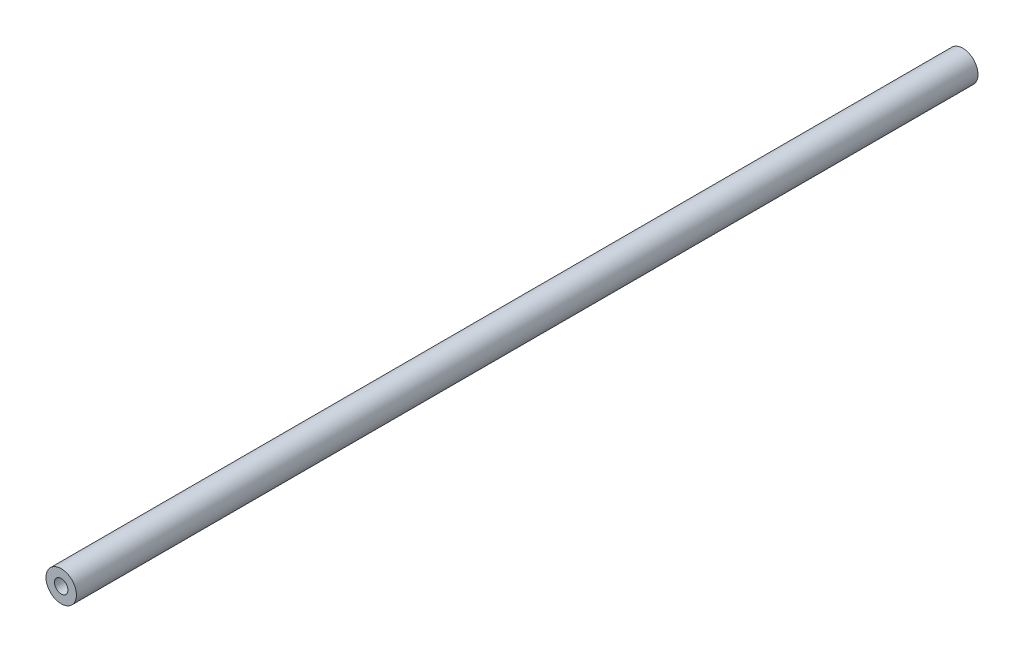
ISO-10303-21;
HEADER;
FILE_DESCRIPTION(('STEP AP214'),'2;1');
FILE_NAME('part.step','',(''),(''),'','','');
FILE_SCHEMA(('AUTOMOTIVE_DESIGN { 1 0 10303 214 1 1 1 1 }'));
ENDSEC;
DATA;
#1=APPLICATION_CONTEXT('core data for automotive mechanical design processes');
#2=APPLICATION_PROTOCOL_DEFINITION('international standard','automotive_design',2000,#1);
#3=PRODUCT_CONTEXT('',#1,'mechanical');
#4=PRODUCT('Part','Part','',(#3));
#5=PRODUCT_RELATED_PRODUCT_CATEGORY('part','',(#4));
#6=PRODUCT_DEFINITION_FORMATION('','',#4);
#7=PRODUCT_DEFINITION_CONTEXT('part definition',#1,'design');
#8=PRODUCT_DEFINITION('design','',#6,#7);
#9=PRODUCT_DEFINITION_SHAPE('','',#8);
#10=(LENGTH_UNIT() NAMED_UNIT(*) SI_UNIT(.MILLI.,.METRE.));
#11=(NAMED_UNIT(*) PLANE_ANGLE_UNIT() SI_UNIT($,.RADIAN.));
#12=(NAMED_UNIT(*) SI_UNIT($,.STERADIAN.) SOLID_ANGLE_UNIT());
#13=UNCERTAINTY_MEASURE_WITH_UNIT(LENGTH_MEASURE(1.E-05),#10,'distance_accuracy_value','');
#14=(GEOMETRIC_REPRESENTATION_CONTEXT(3) GLOBAL_UNCERTAINTY_ASSIGNED_CONTEXT((#13)) GLOBAL_UNIT_ASSIGNED_CONTEXT((#10,
#11,#12)) REPRESENTATION_CONTEXT('',''));
#15=CARTESIAN_POINT('',(0.,0.,0.));
#16=DIRECTION('',(0.,0.,1.));
#17=DIRECTION('',(1.,0.,0.));
#18=AXIS2_PLACEMENT_3D('',#15,#16,#17);
#19=CARTESIAN_POINT('',(0.,0.,117.475));
#20=DIRECTION('',(0.,0.,-1.));
#21=DIRECTION('',(-1.,0.,0.));
#22=AXIS2_PLACEMENT_3D('',#19,#20,#21);
#23=CYLINDRICAL_SURFACE('',#22,3.96875);
#24=CARTESIAN_POINT('',(0.,0.,117.475));
#25=DIRECTION('',(0.,0.,1.));
#26=DIRECTION('',(1.,0.,0.));
#27=AXIS2_PLACEMENT_3D('',#24,#25,#26);
#28=CIRCLE('',#27,3.96875);
#29=CARTESIAN_POINT('',(3.96875,0.,117.475));
#30=VERTEX_POINT('',#29);
#31=EDGE_CURVE('E11',#30,#30,#28,.T.);
#32=ORIENTED_EDGE('',*,*,#31,.F.);
#33=EDGE_LOOP('',(#32));
#34=FACE_BOUND('',#33,.T.);
#35=CARTESIAN_POINT('',(0.,0.,-117.475));
#36=DIRECTION('',(0.,0.,1.));
#37=DIRECTION('',(1.,0.,0.));
#38=AXIS2_PLACEMENT_3D('',#35,#36,#37);
#39=CIRCLE('',#38,3.96875);
#40=CARTESIAN_POINT('',(3.96875,0.,-117.475));
#41=VERTEX_POINT('',#40);
#42=EDGE_CURVE('E37',#41,#41,#39,.T.);
#43=ORIENTED_EDGE('',*,*,#42,.T.);
#44=EDGE_LOOP('',(#43));
#45=FACE_BOUND('',#44,.T.);
#46=ADVANCED_FACE('F34',(#34,#45),#23,.T.);
#47=CARTESIAN_POINT('',(0.,0.,117.475));
#48=DIRECTION('',(0.,0.,1.));
#49=DIRECTION('',(1.,0.,0.));
#50=AXIS2_PLACEMENT_3D('',#47,#48,#49);
#51=PLANE('',#50);
#52=CARTESIAN_POINT('',(0.,0.,117.475));
#53=DIRECTION('',(0.,0.,1.));
#54=DIRECTION('',(1.,0.,0.));
#55=AXIS2_PLACEMENT_3D('',#52,#53,#54);
#56=CIRCLE('',#55,1.7526);
#57=CARTESIAN_POINT('',(1.7526,0.,117.475));
#58=VERTEX_POINT('',#57);
#59=EDGE_CURVE('E191',#58,#58,#56,.T.);
#60=ORIENTED_EDGE('',*,*,#59,.F.);
#61=EDGE_LOOP('',(#60));
#62=FACE_BOUND('',#61,.T.);
#63=ORIENTED_EDGE('',*,*,#31,.T.);
#64=EDGE_LOOP('',(#63));
#65=FACE_BOUND('',#64,.T.);
#66=ADVANCED_FACE('F84',(#62,#65),#51,.T.);
#67=CARTESIAN_POINT('',(0.,0.,-117.475));
#68=DIRECTION('',(0.,0.,1.));
#69=DIRECTION('',(1.,0.,0.));
#70=AXIS2_PLACEMENT_3D('',#67,#68,#69);
#71=PLANE('',#70);
#72=CARTESIAN_POINT('',(0.,0.,-117.475));
#73=DIRECTION('',(0.,0.,-1.));
#74=DIRECTION('',(-1.,0.,0.));
#75=AXIS2_PLACEMENT_3D('',#72,#73,#74);
#76=CIRCLE('',#75,1.7526);
#77=CARTESIAN_POINT('',(-1.7526,0.,-117.475));
#78=VERTEX_POINT('',#77);
#79=EDGE_CURVE('E57',#78,#78,#76,.T.);
#80=ORIENTED_EDGE('',*,*,#79,.F.);
#81=EDGE_LOOP('',(#80));
#82=FACE_BOUND('',#81,.T.);
#83=ORIENTED_EDGE('',*,*,#42,.F.);
#84=EDGE_LOOP('',(#83));
#85=FACE_BOUND('',#84,.T.);
#86=ADVANCED_FACE('F81',(#82,#85),#71,.F.);
#87=CARTESIAN_POINT('',(0.,0.,-108.077));
#88=DIRECTION('',(0.,0.,-1.));
#89=DIRECTION('',(-1.,0.,0.));
#90=AXIS2_PLACEMENT_3D('',#87,#88,#89);
#91=CONICAL_SURFACE('',#90,1.35255,1.02974425867665);
#92=CARTESIAN_POINT('',(0.,0.,-107.264305969734));
#93=VERTEX_POINT('',#92);
#94=VERTEX_LOOP('',#93);
#95=FACE_BOUND('',#94,.T.);
#96=CARTESIAN_POINT('',(0.,0.,-108.077));
#97=DIRECTION('',(0.,0.,-1.));
#98=DIRECTION('',(-1.,0.,0.));
#99=AXIS2_PLACEMENT_3D('',#96,#97,#98);
#100=CIRCLE('',#99,1.35255);
#101=CARTESIAN_POINT('',(-1.35255,0.,-108.077));
#102=VERTEX_POINT('',#101);
#103=EDGE_CURVE('E73',#102,#102,#100,.T.);
#104=ORIENTED_EDGE('',*,*,#103,.T.);
#105=EDGE_LOOP('',(#104));
#106=FACE_BOUND('',#105,.T.);
#107=ADVANCED_FACE('F83',(#95,#106),#91,.F.);
#108=CARTESIAN_POINT('',(0.,0.,-117.475));
#109=DIRECTION('',(0.,0.,-1.));
#110=DIRECTION('',(-1.,0.,0.));
#111=AXIS2_PLACEMENT_3D('',#108,#109,#110);
#112=CYLINDRICAL_SURFACE('',#111,1.35255);
#113=ORIENTED_EDGE('',*,*,#103,.F.);
#114=EDGE_LOOP('',(#113));
#115=FACE_BOUND('',#114,.T.);
#116=CARTESIAN_POINT('',(0.,0.,-110.363));
#117=DIRECTION('',(0.,0.,-1.));
#118=DIRECTION('',(-1.,0.,0.));
#119=AXIS2_PLACEMENT_3D('',#116,#117,#118);
#120=CIRCLE('',#119,1.35255);
#121=CARTESIAN_POINT('',(-1.35255,0.,-110.363));
#122=VERTEX_POINT('',#121);
#123=EDGE_CURVE('E70',#122,#122,#120,.T.);
#124=ORIENTED_EDGE('',*,*,#123,.T.);
#125=EDGE_LOOP('',(#124));
#126=FACE_BOUND('',#125,.T.);
#127=ADVANCED_FACE('F90',(#115,#126),#112,.F.);
#128=CARTESIAN_POINT('',(1.35255,0.,-110.363));
#129=DIRECTION('',(0.,0.,1.));
#130=DIRECTION('',(1.,0.,0.));
#131=AXIS2_PLACEMENT_3D('',#128,#129,#130);
#132=PLANE('',#131);
#133=ORIENTED_EDGE('',*,*,#123,.F.);
#134=EDGE_LOOP('',(#133));
#135=FACE_BOUND('',#134,.T.);
#136=CARTESIAN_POINT('',(0.,0.,-110.363));
#137=DIRECTION('',(0.,0.,-1.));
#138=DIRECTION('',(-1.,0.,0.));
#139=AXIS2_PLACEMENT_3D('',#136,#137,#138);
#140=CIRCLE('',#139,1.7526);
#141=CARTESIAN_POINT('',(-1.7526,0.,-110.363));
#142=VERTEX_POINT('',#141);
#143=EDGE_CURVE('E61',#142,#142,#140,.T.);
#144=ORIENTED_EDGE('',*,*,#143,.T.);
#145=EDGE_LOOP('',(#144));
#146=FACE_BOUND('',#145,.T.);
#147=ADVANCED_FACE('F153',(#135,#146),#132,.F.);
#148=CARTESIAN_POINT('',(0.,0.,-117.475));
#149=DIRECTION('',(0.,0.,-1.));
#150=DIRECTION('',(-1.,0.,0.));
#151=AXIS2_PLACEMENT_3D('',#148,#149,#150);
#152=CYLINDRICAL_SURFACE('',#151,1.7526);
#153=ORIENTED_EDGE('',*,*,#143,.F.);
#154=EDGE_LOOP('',(#153));
#155=FACE_BOUND('',#154,.T.);
#156=ORIENTED_EDGE('',*,*,#79,.T.);
#157=EDGE_LOOP('',(#156));
#158=FACE_BOUND('',#157,.T.);
#159=ADVANCED_FACE('F51',(#155,#158),#152,.F.);
#160=CARTESIAN_POINT('',(0.,0.,108.077));
#161=DIRECTION('',(0.,0.,1.));
#162=DIRECTION('',(1.,0.,0.));
#163=AXIS2_PLACEMENT_3D('',#160,#161,#162);
#164=CONICAL_SURFACE('',#163,1.35255,1.02974425867665);
#165=CARTESIAN_POINT('',(0.,0.,107.264305969734));
#166=VERTEX_POINT('',#165);
#167=VERTEX_LOOP('',#166);
#168=FACE_BOUND('',#167,.T.);
#169=CARTESIAN_POINT('',(0.,0.,108.077));
#170=DIRECTION('',(0.,0.,1.));
#171=DIRECTION('',(1.,0.,0.));
#172=AXIS2_PLACEMENT_3D('',#169,#170,#171);
#173=CIRCLE('',#172,1.35255);
#174=CARTESIAN_POINT('',(1.35255,0.,108.077));
#175=VERTEX_POINT('',#174);
#176=EDGE_CURVE('E55',#175,#175,#173,.T.);
#177=ORIENTED_EDGE('',*,*,#176,.T.);
#178=EDGE_LOOP('',(#177));
#179=FACE_BOUND('',#178,.T.);
#180=ADVANCED_FACE('F47',(#168,#179),#164,.F.);
#181=CARTESIAN_POINT('',(0.,0.,117.475));
#182=DIRECTION('',(0.,0.,1.));
#183=DIRECTION('',(1.,0.,0.));
#184=AXIS2_PLACEMENT_3D('',#181,#182,#183);
#185=CYLINDRICAL_SURFACE('',#184,1.35255);
#186=ORIENTED_EDGE('',*,*,#176,.F.);
#187=EDGE_LOOP('',(#186));
#188=FACE_BOUND('',#187,.T.);
#189=CARTESIAN_POINT('',(0.,0.,110.363));
#190=DIRECTION('',(0.,0.,1.));
#191=DIRECTION('',(1.,0.,0.));
#192=AXIS2_PLACEMENT_3D('',#189,#190,#191);
#193=CIRCLE('',#192,1.35255);
#194=CARTESIAN_POINT('',(1.35255,0.,110.363));
#195=VERTEX_POINT('',#194);
#196=EDGE_CURVE('E58',#195,#195,#193,.T.);
#197=ORIENTED_EDGE('',*,*,#196,.T.);
#198=EDGE_LOOP('',(#197));
#199=FACE_BOUND('',#198,.T.);
#200=ADVANCED_FACE('F50',(#188,#199),#185,.F.);
#201=CARTESIAN_POINT('',(1.35255,0.,110.363));
#202=DIRECTION('',(0.,0.,-1.));
#203=DIRECTION('',(-1.,0.,0.));
#204=AXIS2_PLACEMENT_3D('',#201,#202,#203);
#205=PLANE('',#204);
#206=ORIENTED_EDGE('',*,*,#196,.F.);
#207=EDGE_LOOP('',(#206));
#208=FACE_BOUND('',#207,.T.);
#209=CARTESIAN_POINT('',(0.,0.,110.363));
#210=DIRECTION('',(0.,0.,1.));
#211=DIRECTION('',(1.,0.,0.));
#212=AXIS2_PLACEMENT_3D('',#209,#210,#211);
#213=CIRCLE('',#212,1.7526);
#214=CARTESIAN_POINT('',(1.7526,0.,110.363));
#215=VERTEX_POINT('',#214);
#216=EDGE_CURVE('E64',#215,#215,#213,.T.);
#217=ORIENTED_EDGE('',*,*,#216,.T.);
#218=EDGE_LOOP('',(#217));
#219=FACE_BOUND('',#218,.T.);
#220=ADVANCED_FACE('F126',(#208,#219),#205,.F.);
#221=CARTESIAN_POINT('',(0.,0.,117.475));
#222=DIRECTION('',(0.,0.,1.));
#223=DIRECTION('',(1.,0.,0.));
#224=AXIS2_PLACEMENT_3D('',#221,#222,#223);
#225=CYLINDRICAL_SURFACE('',#224,1.7526);
#226=ORIENTED_EDGE('',*,*,#216,.F.);
#227=EDGE_LOOP('',(#226));
#228=FACE_BOUND('',#227,.T.);
#229=ORIENTED_EDGE('',*,*,#59,.T.);
#230=EDGE_LOOP('',(#229));
#231=FACE_BOUND('',#230,.T.);
#232=ADVANCED_FACE('F135',(#228,#231),#225,.F.);
#233=CLOSED_SHELL('',(#46,#66,#86,#107,#127,#147,#159,#180,#200,#220,#232));
#234=MANIFOLD_SOLID_BREP('B2',#233);
#235=ADVANCED_BREP_SHAPE_REPRESENTATION('',(#18,#234),#14);
#236=SHAPE_DEFINITION_REPRESENTATION(#9,#235);
ENDSEC;
END-ISO-10303-21;
